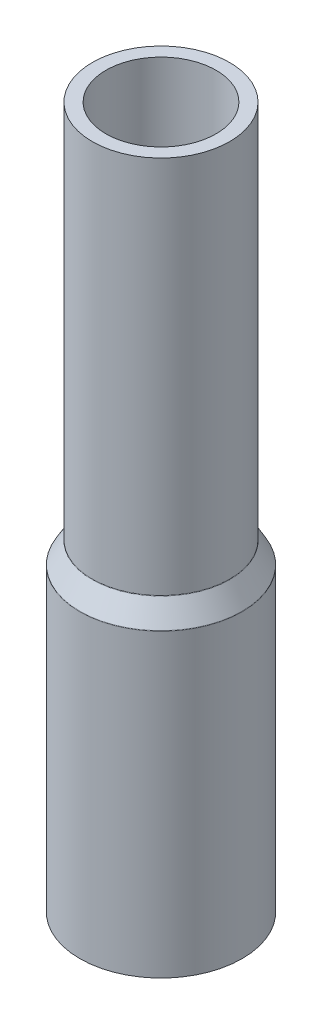
ISO-10303-21;
HEADER;
FILE_DESCRIPTION(('STEP AP214'),'2;1');
FILE_NAME('part.step','',(''),(''),'','','');
FILE_SCHEMA(('AUTOMOTIVE_DESIGN { 1 0 10303 214 1 1 1 1 }'));
ENDSEC;
DATA;
#1=APPLICATION_CONTEXT('core data for automotive mechanical design processes');
#2=APPLICATION_PROTOCOL_DEFINITION('international standard','automotive_design',2000,#1);
#3=PRODUCT_CONTEXT('',#1,'mechanical');
#4=PRODUCT('Part','Part','',(#3));
#5=PRODUCT_RELATED_PRODUCT_CATEGORY('part','',(#4));
#6=PRODUCT_DEFINITION_FORMATION('','',#4);
#7=PRODUCT_DEFINITION_CONTEXT('part definition',#1,'design');
#8=PRODUCT_DEFINITION('design','',#6,#7);
#9=PRODUCT_DEFINITION_SHAPE('','',#8);
#10=(LENGTH_UNIT() NAMED_UNIT(*) SI_UNIT(.MILLI.,.METRE.));
#11=(NAMED_UNIT(*) PLANE_ANGLE_UNIT() SI_UNIT($,.RADIAN.));
#12=(NAMED_UNIT(*) SI_UNIT($,.STERADIAN.) SOLID_ANGLE_UNIT());
#13=UNCERTAINTY_MEASURE_WITH_UNIT(LENGTH_MEASURE(1.E-05),#10,'distance_accuracy_value','');
#14=(GEOMETRIC_REPRESENTATION_CONTEXT(3) GLOBAL_UNCERTAINTY_ASSIGNED_CONTEXT((#13)) GLOBAL_UNIT_ASSIGNED_CONTEXT((#10,
#11,#12)) REPRESENTATION_CONTEXT('',''));
#15=CARTESIAN_POINT('',(0.,0.,0.));
#16=DIRECTION('',(0.,0.,1.));
#17=DIRECTION('',(1.,0.,0.));
#18=AXIS2_PLACEMENT_3D('',#15,#16,#17);
#19=CARTESIAN_POINT('',(0.,3.,0.));
#20=DIRECTION('',(0.,-1.,0.));
#21=DIRECTION('',(0.,0.,-1.));
#22=AXIS2_PLACEMENT_3D('',#19,#20,#21);
#23=CYLINDRICAL_SURFACE('',#22,0.685);
#24=CARTESIAN_POINT('',(0.,0.,0.));
#25=DIRECTION('',(0.,1.,0.));
#26=DIRECTION('',(0.,0.,1.));
#27=AXIS2_PLACEMENT_3D('',#24,#25,#26);
#28=CIRCLE('',#27,0.685);
#29=CARTESIAN_POINT('',(0.,0.,0.685));
#30=VERTEX_POINT('',#29);
#31=EDGE_CURVE('E53',#30,#30,#28,.T.);
#32=ORIENTED_EDGE('',*,*,#31,.F.);
#33=EDGE_LOOP('',(#32));
#34=FACE_BOUND('',#33,.T.);
#35=CARTESIAN_POINT('',(0.,3.,0.));
#36=DIRECTION('',(0.,1.,0.));
#37=DIRECTION('',(0.,0.,1.));
#38=AXIS2_PLACEMENT_3D('',#35,#36,#37);
#39=CIRCLE('',#38,0.685);
#40=CARTESIAN_POINT('',(0.,3.,0.685));
#41=VERTEX_POINT('',#40);
#42=EDGE_CURVE('E57',#41,#41,#39,.T.);
#43=ORIENTED_EDGE('',*,*,#42,.T.);
#44=EDGE_LOOP('',(#43));
#45=FACE_BOUND('',#44,.T.);
#46=ADVANCED_FACE('F30',(#34,#45),#23,.F.);
#47=CARTESIAN_POINT('',(0.,0.,0.));
#48=DIRECTION('',(0.,1.,0.));
#49=DIRECTION('',(0.,0.,1.));
#50=AXIS2_PLACEMENT_3D('',#47,#48,#49);
#51=PLANE('',#50);
#52=CARTESIAN_POINT('',(0.,0.,0.));
#53=DIRECTION('',(0.,1.,0.));
#54=DIRECTION('',(0.,0.,1.));
#55=AXIS2_PLACEMENT_3D('',#52,#53,#54);
#56=CIRCLE('',#55,0.81);
#57=CARTESIAN_POINT('',(0.,0.,0.81));
#58=VERTEX_POINT('',#57);
#59=EDGE_CURVE('E50',#58,#58,#56,.T.);
#60=ORIENTED_EDGE('',*,*,#59,.F.);
#61=EDGE_LOOP('',(#60));
#62=FACE_BOUND('',#61,.T.);
#63=ORIENTED_EDGE('',*,*,#31,.T.);
#64=EDGE_LOOP('',(#63));
#65=FACE_BOUND('',#64,.T.);
#66=ADVANCED_FACE('F88',(#62,#65),#51,.F.);
#67=CARTESIAN_POINT('',(0.,3.,0.));
#68=DIRECTION('',(0.,-1.,0.));
#69=DIRECTION('',(0.,0.,-1.));
#70=AXIS2_PLACEMENT_3D('',#67,#68,#69);
#71=CYLINDRICAL_SURFACE('',#70,0.81);
#72=CARTESIAN_POINT('',(0.,2.99732050807569,0.));
#73=DIRECTION('',(0.,-1.,0.));
#74=DIRECTION('',(0.,0.,-1.));
#75=AXIS2_PLACEMENT_3D('',#72,#73,#74);
#76=CIRCLE('',#75,0.81);
#77=CARTESIAN_POINT('',(0.,2.99732050807569,-0.81));
#78=VERTEX_POINT('',#77);
#79=EDGE_CURVE('E41',#78,#78,#76,.T.);
#80=ORIENTED_EDGE('',*,*,#79,.T.);
#81=EDGE_LOOP('',(#80));
#82=FACE_BOUND('',#81,.T.);
#83=ORIENTED_EDGE('',*,*,#59,.T.);
#84=EDGE_LOOP('',(#83));
#85=FACE_BOUND('',#84,.T.);
#86=ADVANCED_FACE('F94',(#82,#85),#71,.T.);
#87=CARTESIAN_POINT('',(0.,3.21650635094611,0.));
#88=DIRECTION('',(0.,-1.,0.));
#89=DIRECTION('',(0.,0.,-1.));
#90=AXIS2_PLACEMENT_3D('',#87,#88,#89);
#91=CONICAL_SURFACE('',#90,0.685,0.523598775598303);
#92=CARTESIAN_POINT('',(0.,3.21418584287042,0.));
#93=DIRECTION('',(0.,-1.,0.));
#94=DIRECTION('',(0.,0.,-1.));
#95=AXIS2_PLACEMENT_3D('',#92,#93,#94);
#96=CIRCLE('',#95,0.686339745962156);
#97=CARTESIAN_POINT('',(0.,3.21418584287042,-0.686339745962156));
#98=VERTEX_POINT('',#97);
#99=EDGE_CURVE('E10',#98,#98,#96,.T.);
#100=ORIENTED_EDGE('',*,*,#99,.T.);
#101=EDGE_LOOP('',(#100));
#102=FACE_BOUND('',#101,.T.);
#103=CARTESIAN_POINT('',(0.,3.00232050807569,0.));
#104=DIRECTION('',(0.,1.,0.));
#105=DIRECTION('',(0.,0.,1.));
#106=AXIS2_PLACEMENT_3D('',#103,#104,#105);
#107=CIRCLE('',#106,0.808660254037845);
#108=CARTESIAN_POINT('',(0.,3.00232050807569,0.808660254037845));
#109=VERTEX_POINT('',#108);
#110=EDGE_CURVE('E45',#109,#109,#107,.T.);
#111=ORIENTED_EDGE('',*,*,#110,.T.);
#112=EDGE_LOOP('',(#111));
#113=FACE_BOUND('',#112,.T.);
#114=ADVANCED_FACE('F84',(#102,#113),#91,.T.);
#115=CARTESIAN_POINT('',(0.,7.,0.));
#116=DIRECTION('',(0.,-1.,0.));
#117=DIRECTION('',(0.,0.,-1.));
#118=AXIS2_PLACEMENT_3D('',#115,#116,#117);
#119=CYLINDRICAL_SURFACE('',#118,0.685);
#120=CARTESIAN_POINT('',(0.,3.21918584287042,0.));
#121=DIRECTION('',(0.,1.,0.));
#122=DIRECTION('',(0.,0.,1.));
#123=AXIS2_PLACEMENT_3D('',#120,#121,#122);
#124=CIRCLE('',#123,0.685);
#125=CARTESIAN_POINT('',(0.,3.21918584287042,0.685));
#126=VERTEX_POINT('',#125);
#127=EDGE_CURVE('E37',#126,#126,#124,.T.);
#128=ORIENTED_EDGE('',*,*,#127,.T.);
#129=EDGE_LOOP('',(#128));
#130=FACE_BOUND('',#129,.T.);
#131=CARTESIAN_POINT('',(0.,7.,0.));
#132=DIRECTION('',(0.,1.,0.));
#133=DIRECTION('',(0.,0.,1.));
#134=AXIS2_PLACEMENT_3D('',#131,#132,#133);
#135=CIRCLE('',#134,0.685);
#136=CARTESIAN_POINT('',(0.,7.,0.685));
#137=VERTEX_POINT('',#136);
#138=EDGE_CURVE('E56',#137,#137,#135,.T.);
#139=ORIENTED_EDGE('',*,*,#138,.F.);
#140=EDGE_LOOP('',(#139));
#141=FACE_BOUND('',#140,.T.);
#142=ADVANCED_FACE('F75',(#130,#141),#119,.T.);
#143=CARTESIAN_POINT('',(0.,7.,0.));
#144=DIRECTION('',(0.,1.,0.));
#145=DIRECTION('',(0.,0.,1.));
#146=AXIS2_PLACEMENT_3D('',#143,#144,#145);
#147=PLANE('',#146);
#148=ORIENTED_EDGE('',*,*,#138,.T.);
#149=EDGE_LOOP('',(#148));
#150=FACE_BOUND('',#149,.T.);
#151=CARTESIAN_POINT('',(0.,7.,0.));
#152=DIRECTION('',(0.,1.,0.));
#153=DIRECTION('',(0.,0.,1.));
#154=AXIS2_PLACEMENT_3D('',#151,#152,#153);
#155=CIRCLE('',#154,0.55);
#156=CARTESIAN_POINT('',(0.,7.,0.55));
#157=VERTEX_POINT('',#156);
#158=EDGE_CURVE('E60',#157,#157,#155,.T.);
#159=ORIENTED_EDGE('',*,*,#158,.F.);
#160=EDGE_LOOP('',(#159));
#161=FACE_BOUND('',#160,.T.);
#162=ADVANCED_FACE('F72',(#150,#161),#147,.T.);
#163=CARTESIAN_POINT('',(0.,3.,0.));
#164=DIRECTION('',(0.,1.,0.));
#165=DIRECTION('',(0.,0.,1.));
#166=AXIS2_PLACEMENT_3D('',#163,#164,#165);
#167=PLANE('',#166);
#168=ORIENTED_EDGE('',*,*,#42,.F.);
#169=EDGE_LOOP('',(#168));
#170=FACE_BOUND('',#169,.T.);
#171=CARTESIAN_POINT('',(0.,3.,0.));
#172=DIRECTION('',(0.,1.,0.));
#173=DIRECTION('',(0.,0.,1.));
#174=AXIS2_PLACEMENT_3D('',#171,#172,#173);
#175=CIRCLE('',#174,0.55);
#176=CARTESIAN_POINT('',(0.,3.,0.55));
#177=VERTEX_POINT('',#176);
#178=EDGE_CURVE('E63',#177,#177,#175,.T.);
#179=ORIENTED_EDGE('',*,*,#178,.T.);
#180=EDGE_LOOP('',(#179));
#181=FACE_BOUND('',#180,.T.);
#182=ADVANCED_FACE('F74',(#170,#181),#167,.F.);
#183=CARTESIAN_POINT('',(0.,7.,0.));
#184=DIRECTION('',(0.,-1.,0.));
#185=DIRECTION('',(0.,0.,-1.));
#186=AXIS2_PLACEMENT_3D('',#183,#184,#185);
#187=CYLINDRICAL_SURFACE('',#186,0.55);
#188=ORIENTED_EDGE('',*,*,#158,.T.);
#189=EDGE_LOOP('',(#188));
#190=FACE_BOUND('',#189,.T.);
#191=ORIENTED_EDGE('',*,*,#178,.F.);
#192=EDGE_LOOP('',(#191));
#193=FACE_BOUND('',#192,.T.);
#194=ADVANCED_FACE('F69',(#190,#193),#187,.F.);
#195=CARTESIAN_POINT('',(0.,2.99732050807569,0.));
#196=DIRECTION('',(0.,-1.,0.));
#197=DIRECTION('',(0.,0.,-1.));
#198=AXIS2_PLACEMENT_3D('',#195,#196,#197);
#199=TOROIDAL_SURFACE('',#198,0.8,0.01);
#200=ORIENTED_EDGE('',*,*,#79,.F.);
#201=EDGE_LOOP('',(#200));
#202=FACE_BOUND('',#201,.T.);
#203=ORIENTED_EDGE('',*,*,#110,.F.);
#204=EDGE_LOOP('',(#203));
#205=FACE_BOUND('',#204,.T.);
#206=ADVANCED_FACE('F103',(#202,#205),#199,.T.);
#207=CARTESIAN_POINT('',(0.,3.21918584287042,0.));
#208=DIRECTION('',(0.,1.,0.));
#209=DIRECTION('',(0.,0.,1.));
#210=AXIS2_PLACEMENT_3D('',#207,#208,#209);
#211=TOROIDAL_SURFACE('',#210,0.695,0.01);
#212=ORIENTED_EDGE('',*,*,#99,.F.);
#213=EDGE_LOOP('',(#212));
#214=FACE_BOUND('',#213,.T.);
#215=ORIENTED_EDGE('',*,*,#127,.F.);
#216=EDGE_LOOP('',(#215));
#217=FACE_BOUND('',#216,.T.);
#218=ADVANCED_FACE('F32',(#214,#217),#211,.F.);
#219=CLOSED_SHELL('',(#46,#66,#86,#114,#142,#162,#182,#194,#206,#218));
#220=MANIFOLD_SOLID_BREP('B2',#219);
#221=ADVANCED_BREP_SHAPE_REPRESENTATION('',(#18,#220),#14);
#222=SHAPE_DEFINITION_REPRESENTATION(#9,#221);
ENDSEC;
END-ISO-10303-21;
